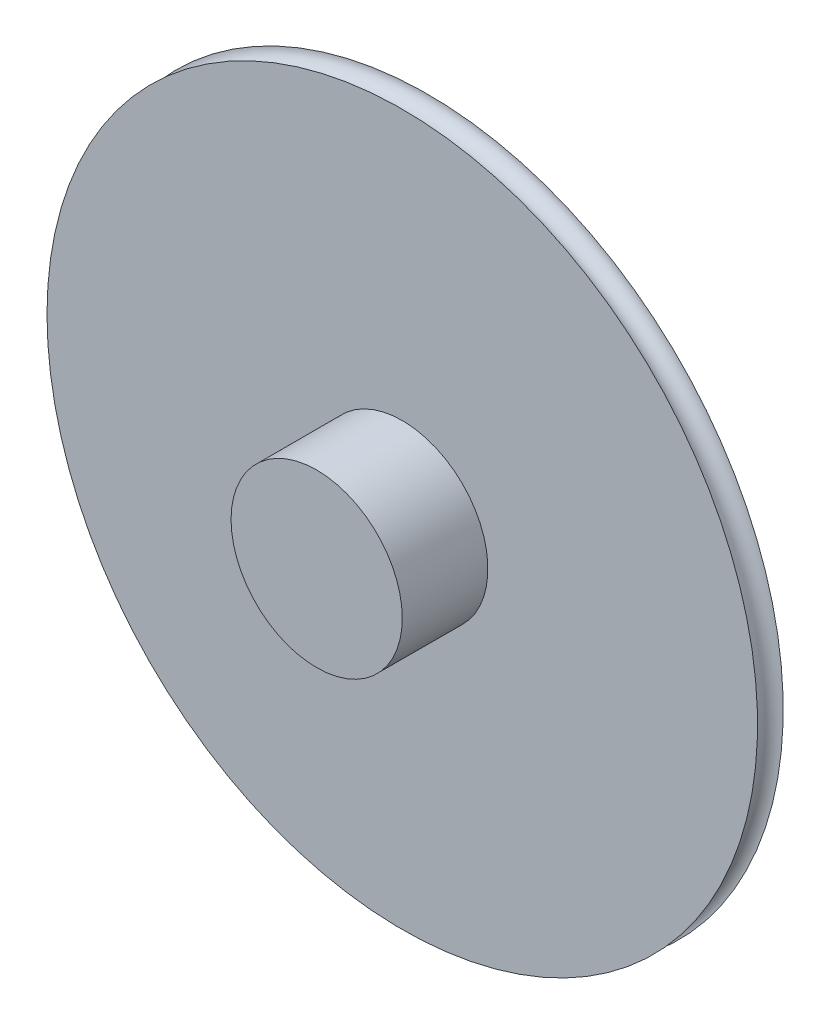
ISO-10303-21;
HEADER;
FILE_DESCRIPTION(('STEP AP214'),'2;1');
FILE_NAME('part.step','',(''),(''),'','','');
FILE_SCHEMA(('AUTOMOTIVE_DESIGN { 1 0 10303 214 1 1 1 1 }'));
ENDSEC;
DATA;
#1=APPLICATION_CONTEXT('core data for automotive mechanical design processes');
#2=APPLICATION_PROTOCOL_DEFINITION('international standard','automotive_design',2000,#1);
#3=PRODUCT_CONTEXT('',#1,'mechanical');
#4=PRODUCT('Part','Part','',(#3));
#5=PRODUCT_RELATED_PRODUCT_CATEGORY('part','',(#4));
#6=PRODUCT_DEFINITION_FORMATION('','',#4);
#7=PRODUCT_DEFINITION_CONTEXT('part definition',#1,'design');
#8=PRODUCT_DEFINITION('design','',#6,#7);
#9=PRODUCT_DEFINITION_SHAPE('','',#8);
#10=(LENGTH_UNIT() NAMED_UNIT(*) SI_UNIT(.MILLI.,.METRE.));
#11=(NAMED_UNIT(*) PLANE_ANGLE_UNIT() SI_UNIT($,.RADIAN.));
#12=(NAMED_UNIT(*) SI_UNIT($,.STERADIAN.) SOLID_ANGLE_UNIT());
#13=UNCERTAINTY_MEASURE_WITH_UNIT(LENGTH_MEASURE(1.E-05),#10,'distance_accuracy_value','');
#14=(GEOMETRIC_REPRESENTATION_CONTEXT(3) GLOBAL_UNCERTAINTY_ASSIGNED_CONTEXT((#13)) GLOBAL_UNIT_ASSIGNED_CONTEXT((#10,
#11,#12)) REPRESENTATION_CONTEXT('',''));
#15=CARTESIAN_POINT('',(0.,0.,0.));
#16=DIRECTION('',(0.,0.,1.));
#17=DIRECTION('',(1.,0.,0.));
#18=AXIS2_PLACEMENT_3D('',#15,#16,#17);
#19=CARTESIAN_POINT('',(41.5,0.,1.5));
#20=DIRECTION('',(0.,0.,-1.));
#21=DIRECTION('',(-1.,0.,0.));
#22=AXIS2_PLACEMENT_3D('',#19,#20,#21);
#23=PLANE('',#22);
#24=CARTESIAN_POINT('',(0.,0.,1.50000000000001));
#25=DIRECTION('',(0.,0.,-1.));
#26=DIRECTION('',(-1.,0.,0.));
#27=AXIS2_PLACEMENT_3D('',#24,#25,#26);
#28=CIRCLE('',#27,10.);
#29=CARTESIAN_POINT('',(-10.,0.,1.50000000000001));
#30=VERTEX_POINT('',#29);
#31=EDGE_CURVE('E10',#30,#30,#28,.F.);
#32=ORIENTED_EDGE('',*,*,#31,.F.);
#33=EDGE_LOOP('',(#32));
#34=FACE_BOUND('',#33,.T.);
#35=CARTESIAN_POINT('',(0.,0.,1.50000000000002));
#36=DIRECTION('',(0.,0.,-1.));
#37=DIRECTION('',(-1.,0.,0.));
#38=AXIS2_PLACEMENT_3D('',#35,#36,#37);
#39=CIRCLE('',#38,41.5);
#40=CARTESIAN_POINT('',(-41.5,0.,1.50000000000003));
#41=VERTEX_POINT('',#40);
#42=EDGE_CURVE('E39',#41,#41,#39,.T.);
#43=ORIENTED_EDGE('',*,*,#42,.F.);
#44=EDGE_LOOP('',(#43));
#45=FACE_BOUND('',#44,.T.);
#46=ADVANCED_FACE('F33',(#34,#45),#23,.F.);
#47=CARTESIAN_POINT('',(0.,0.,0.));
#48=DIRECTION('',(0.,0.,-1.));
#49=DIRECTION('',(-1.,0.,0.));
#50=AXIS2_PLACEMENT_3D('',#47,#48,#49);
#51=TOROIDAL_SURFACE('',#50,41.5,1.5);
#52=CARTESIAN_POINT('',(0.,0.,-1.49999999999999));
#53=DIRECTION('',(0.,0.,-1.));
#54=DIRECTION('',(-1.,0.,0.));
#55=AXIS2_PLACEMENT_3D('',#52,#53,#54);
#56=CIRCLE('',#55,41.5);
#57=CARTESIAN_POINT('',(-41.5,0.,-1.49999999999998));
#58=VERTEX_POINT('',#57);
#59=EDGE_CURVE('E43',#58,#58,#56,.T.);
#60=ORIENTED_EDGE('',*,*,#59,.F.);
#61=EDGE_LOOP('',(#60));
#62=FACE_BOUND('',#61,.T.);
#63=ORIENTED_EDGE('',*,*,#42,.T.);
#64=EDGE_LOOP('',(#63));
#65=FACE_BOUND('',#64,.T.);
#66=ADVANCED_FACE('F64',(#62,#65),#51,.F.);
#67=CARTESIAN_POINT('',(0.,0.,-1.49999999999999));
#68=DIRECTION('',(0.,0.,1.));
#69=DIRECTION('',(1.,0.,0.));
#70=AXIS2_PLACEMENT_3D('',#67,#68,#69);
#71=PLANE('',#70);
#72=ORIENTED_EDGE('',*,*,#59,.T.);
#73=EDGE_LOOP('',(#72));
#74=FACE_BOUND('',#73,.T.);
#75=ADVANCED_FACE('F57',(#74),#71,.F.);
#76=CARTESIAN_POINT('',(0.,0.,11.5));
#77=DIRECTION('',(0.,0.,-1.));
#78=DIRECTION('',(-1.,0.,0.));
#79=AXIS2_PLACEMENT_3D('',#76,#77,#78);
#80=CYLINDRICAL_SURFACE('',#79,10.);
#81=CARTESIAN_POINT('',(0.,0.,11.5));
#82=DIRECTION('',(0.,0.,1.));
#83=DIRECTION('',(1.,0.,0.));
#84=AXIS2_PLACEMENT_3D('',#81,#82,#83);
#85=CIRCLE('',#84,10.);
#86=CARTESIAN_POINT('',(10.,0.,11.5));
#87=VERTEX_POINT('',#86);
#88=EDGE_CURVE('E47',#87,#87,#85,.T.);
#89=ORIENTED_EDGE('',*,*,#88,.F.);
#90=EDGE_LOOP('',(#89));
#91=FACE_BOUND('',#90,.T.);
#92=ORIENTED_EDGE('',*,*,#31,.T.);
#93=EDGE_LOOP('',(#92));
#94=FACE_BOUND('',#93,.T.);
#95=ADVANCED_FACE('F55',(#91,#94),#80,.T.);
#96=CARTESIAN_POINT('',(0.,0.,11.5));
#97=DIRECTION('',(0.,0.,1.));
#98=DIRECTION('',(1.,0.,0.));
#99=AXIS2_PLACEMENT_3D('',#96,#97,#98);
#100=PLANE('',#99);
#101=ORIENTED_EDGE('',*,*,#88,.T.);
#102=EDGE_LOOP('',(#101));
#103=FACE_BOUND('',#102,.T.);
#104=ADVANCED_FACE('F53',(#103),#100,.T.);
#105=CLOSED_SHELL('',(#46,#66,#75,#95,#104));
#106=MANIFOLD_SOLID_BREP('B2',#105);
#107=ADVANCED_BREP_SHAPE_REPRESENTATION('',(#18,#106),#14);
#108=SHAPE_DEFINITION_REPRESENTATION(#9,#107);
ENDSEC;
END-ISO-10303-21;
